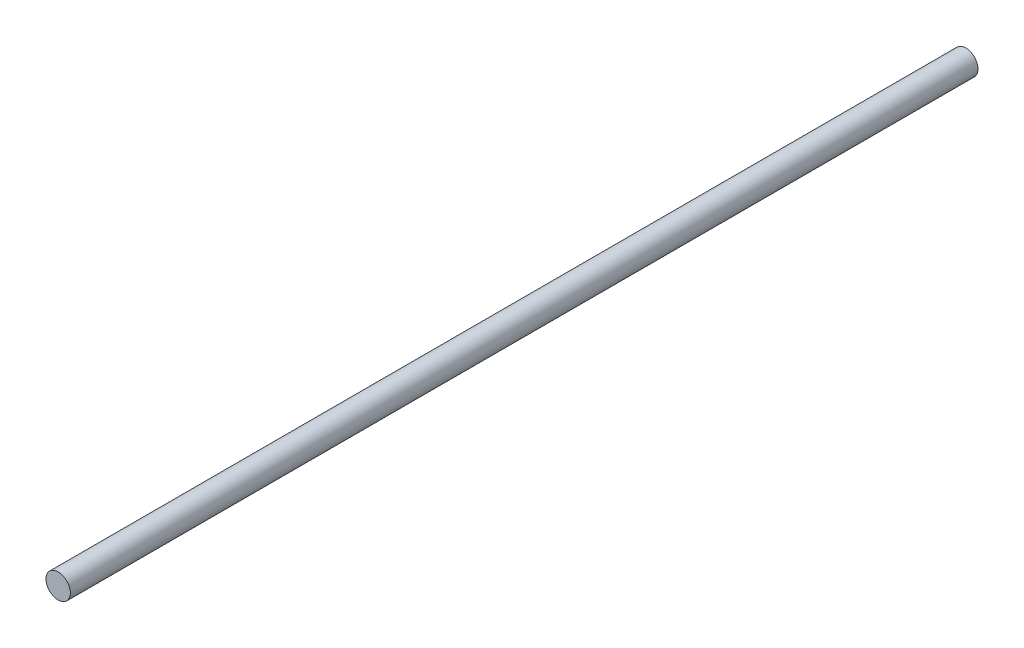
ISO-10303-21;
HEADER;
FILE_DESCRIPTION(('STEP AP214'),'2;1');
FILE_NAME('part.step','',(''),(''),'','','');
FILE_SCHEMA(('AUTOMOTIVE_DESIGN { 1 0 10303 214 1 1 1 1 }'));
ENDSEC;
DATA;
#1=APPLICATION_CONTEXT('core data for automotive mechanical design processes');
#2=APPLICATION_PROTOCOL_DEFINITION('international standard','automotive_design',2000,#1);
#3=PRODUCT_CONTEXT('',#1,'mechanical');
#4=PRODUCT('Part','Part','',(#3));
#5=PRODUCT_RELATED_PRODUCT_CATEGORY('part','',(#4));
#6=PRODUCT_DEFINITION_FORMATION('','',#4);
#7=PRODUCT_DEFINITION_CONTEXT('part definition',#1,'design');
#8=PRODUCT_DEFINITION('design','',#6,#7);
#9=PRODUCT_DEFINITION_SHAPE('','',#8);
#10=(LENGTH_UNIT() NAMED_UNIT(*) SI_UNIT(.MILLI.,.METRE.));
#11=(NAMED_UNIT(*) PLANE_ANGLE_UNIT() SI_UNIT($,.RADIAN.));
#12=(NAMED_UNIT(*) SI_UNIT($,.STERADIAN.) SOLID_ANGLE_UNIT());
#13=UNCERTAINTY_MEASURE_WITH_UNIT(LENGTH_MEASURE(1.E-05),#10,'distance_accuracy_value','');
#14=(GEOMETRIC_REPRESENTATION_CONTEXT(3) GLOBAL_UNCERTAINTY_ASSIGNED_CONTEXT((#13)) GLOBAL_UNIT_ASSIGNED_CONTEXT((#10,
#11,#12)) REPRESENTATION_CONTEXT('',''));
#15=CARTESIAN_POINT('',(0.,0.,0.));
#16=DIRECTION('',(0.,0.,1.));
#17=DIRECTION('',(1.,0.,0.));
#18=AXIS2_PLACEMENT_3D('',#15,#16,#17);
#19=CARTESIAN_POINT('',(0.,0.,944.88));
#20=DIRECTION('',(0.,0.,-1.));
#21=DIRECTION('',(-1.,0.,0.));
#22=AXIS2_PLACEMENT_3D('',#19,#20,#21);
#23=CYLINDRICAL_SURFACE('',#22,12.7);
#24=CARTESIAN_POINT('',(0.,0.,944.88));
#25=DIRECTION('',(0.,0.,1.));
#26=DIRECTION('',(1.,0.,0.));
#27=AXIS2_PLACEMENT_3D('',#24,#25,#26);
#28=CIRCLE('',#27,12.7);
#29=CARTESIAN_POINT('',(12.7,0.,944.88));
#30=VERTEX_POINT('',#29);
#31=EDGE_CURVE('E10',#30,#30,#28,.T.);
#32=ORIENTED_EDGE('',*,*,#31,.F.);
#33=EDGE_LOOP('',(#32));
#34=FACE_BOUND('',#33,.T.);
#35=CARTESIAN_POINT('',(0.,0.,0.));
#36=DIRECTION('',(0.,0.,1.));
#37=DIRECTION('',(1.,0.,0.));
#38=AXIS2_PLACEMENT_3D('',#35,#36,#37);
#39=CIRCLE('',#38,12.7);
#40=CARTESIAN_POINT('',(12.7,0.,0.));
#41=VERTEX_POINT('',#40);
#42=EDGE_CURVE('E40',#41,#41,#39,.T.);
#43=ORIENTED_EDGE('',*,*,#42,.T.);
#44=EDGE_LOOP('',(#43));
#45=FACE_BOUND('',#44,.T.);
#46=ADVANCED_FACE('F37',(#34,#45),#23,.T.);
#47=CARTESIAN_POINT('',(0.,0.,944.88));
#48=DIRECTION('',(0.,0.,1.));
#49=DIRECTION('',(1.,0.,0.));
#50=AXIS2_PLACEMENT_3D('',#47,#48,#49);
#51=PLANE('',#50);
#52=ORIENTED_EDGE('',*,*,#31,.T.);
#53=EDGE_LOOP('',(#52));
#54=FACE_BOUND('',#53,.T.);
#55=ADVANCED_FACE('F52',(#54),#51,.T.);
#56=CARTESIAN_POINT('',(0.,0.,0.));
#57=DIRECTION('',(0.,0.,1.));
#58=DIRECTION('',(1.,0.,0.));
#59=AXIS2_PLACEMENT_3D('',#56,#57,#58);
#60=PLANE('',#59);
#61=ORIENTED_EDGE('',*,*,#42,.F.);
#62=EDGE_LOOP('',(#61));
#63=FACE_BOUND('',#62,.T.);
#64=ADVANCED_FACE('F50',(#63),#60,.F.);
#65=CLOSED_SHELL('',(#46,#55,#64));
#66=MANIFOLD_SOLID_BREP('B2',#65);
#67=ADVANCED_BREP_SHAPE_REPRESENTATION('',(#18,#66),#14);
#68=SHAPE_DEFINITION_REPRESENTATION(#9,#67);
ENDSEC;
END-ISO-10303-21;
